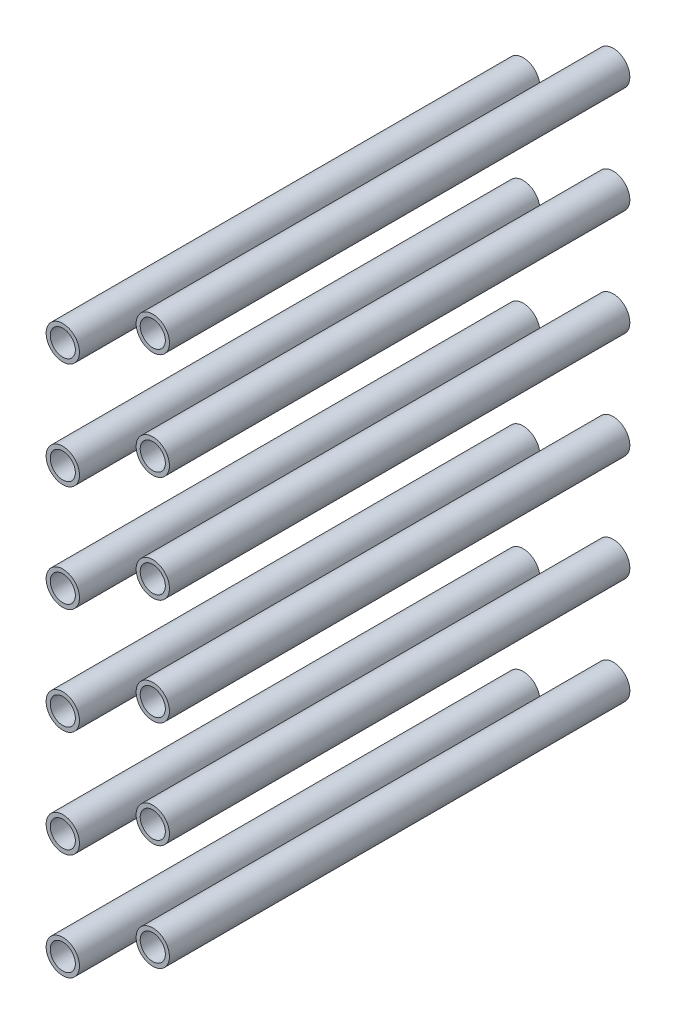
ISO-10303-21;
HEADER;
FILE_DESCRIPTION(('STEP AP214'),'2;1');
FILE_NAME('part.step','',(''),(''),'','','');
FILE_SCHEMA(('AUTOMOTIVE_DESIGN { 1 0 10303 214 1 1 1 1 }'));
ENDSEC;
DATA;
#1=APPLICATION_CONTEXT('core data for automotive mechanical design processes');
#2=APPLICATION_PROTOCOL_DEFINITION('international standard','automotive_design',2000,#1);
#3=PRODUCT_CONTEXT('',#1,'mechanical');
#4=PRODUCT('Part','Part','',(#3));
#5=PRODUCT_RELATED_PRODUCT_CATEGORY('part','',(#4));
#6=PRODUCT_DEFINITION_FORMATION('','',#4);
#7=PRODUCT_DEFINITION_CONTEXT('part definition',#1,'design');
#8=PRODUCT_DEFINITION('design','',#6,#7);
#9=PRODUCT_DEFINITION_SHAPE('','',#8);
#10=(LENGTH_UNIT() NAMED_UNIT(*) SI_UNIT(.MILLI.,.METRE.));
#11=(NAMED_UNIT(*) PLANE_ANGLE_UNIT() SI_UNIT($,.RADIAN.));
#12=(NAMED_UNIT(*) SI_UNIT($,.STERADIAN.) SOLID_ANGLE_UNIT());
#13=UNCERTAINTY_MEASURE_WITH_UNIT(LENGTH_MEASURE(1.E-05),#10,'distance_accuracy_value','');
#14=(GEOMETRIC_REPRESENTATION_CONTEXT(3) GLOBAL_UNCERTAINTY_ASSIGNED_CONTEXT((#13)) GLOBAL_UNIT_ASSIGNED_CONTEXT((#10,
#11,#12)) REPRESENTATION_CONTEXT('',''));
#15=CARTESIAN_POINT('',(0.,0.,0.));
#16=DIRECTION('',(0.,0.,1.));
#17=DIRECTION('',(1.,0.,0.));
#18=AXIS2_PLACEMENT_3D('',#15,#16,#17);
#19=CARTESIAN_POINT('',(21.4999999999996,139.7,-110.));
#20=DIRECTION('',(0.,0.,1.));
#21=DIRECTION('',(1.,0.,0.));
#22=AXIS2_PLACEMENT_3D('',#19,#20,#21);
#23=CYLINDRICAL_SURFACE('',#22,3.98);
#24=CARTESIAN_POINT('',(21.4999999999996,139.7,-110.));
#25=DIRECTION('',(0.,0.,1.));
#26=DIRECTION('',(1.,0.,0.));
#27=AXIS2_PLACEMENT_3D('',#24,#25,#26);
#28=CIRCLE('',#27,3.98);
#29=CARTESIAN_POINT('',(25.4799999999996,139.7,-110.));
#30=VERTEX_POINT('',#29);
#31=EDGE_CURVE('E11',#30,#30,#28,.T.);
#32=ORIENTED_EDGE('',*,*,#31,.T.);
#33=EDGE_LOOP('',(#32));
#34=FACE_BOUND('',#33,.T.);
#35=CARTESIAN_POINT('',(21.4999999999996,139.7,0.));
#36=DIRECTION('',(0.,0.,1.));
#37=DIRECTION('',(1.,0.,0.));
#38=AXIS2_PLACEMENT_3D('',#35,#36,#37);
#39=CIRCLE('',#38,3.98);
#40=CARTESIAN_POINT('',(25.4799999999996,139.7,0.));
#41=VERTEX_POINT('',#40);
#42=EDGE_CURVE('E43',#41,#41,#39,.T.);
#43=ORIENTED_EDGE('',*,*,#42,.F.);
#44=EDGE_LOOP('',(#43));
#45=FACE_BOUND('',#44,.T.);
#46=ADVANCED_FACE('F40',(#34,#45),#23,.T.);
#47=CARTESIAN_POINT('',(21.4999999999996,139.7,-110.));
#48=DIRECTION('',(0.,0.,1.));
#49=DIRECTION('',(1.,0.,0.));
#50=AXIS2_PLACEMENT_3D('',#47,#48,#49);
#51=PLANE('',#50);
#52=CARTESIAN_POINT('',(21.4999999999996,139.7,-110.));
#53=DIRECTION('',(0.,0.,1.));
#54=DIRECTION('',(1.,0.,0.));
#55=AXIS2_PLACEMENT_3D('',#52,#53,#54);
#56=CIRCLE('',#55,3.);
#57=CARTESIAN_POINT('',(24.4999999999996,139.7,-110.));
#58=VERTEX_POINT('',#57);
#59=EDGE_CURVE('E50',#58,#58,#56,.T.);
#60=ORIENTED_EDGE('',*,*,#59,.T.);
#61=EDGE_LOOP('',(#60));
#62=FACE_BOUND('',#61,.T.);
#63=ORIENTED_EDGE('',*,*,#31,.F.);
#64=EDGE_LOOP('',(#63));
#65=FACE_BOUND('',#64,.T.);
#66=ADVANCED_FACE('F58',(#62,#65),#51,.F.);
#67=CARTESIAN_POINT('',(21.4999999999996,139.7,0.));
#68=DIRECTION('',(0.,0.,1.));
#69=DIRECTION('',(1.,0.,0.));
#70=AXIS2_PLACEMENT_3D('',#67,#68,#69);
#71=PLANE('',#70);
#72=CARTESIAN_POINT('',(21.4999999999996,139.7,0.));
#73=DIRECTION('',(0.,0.,1.));
#74=DIRECTION('',(1.,0.,0.));
#75=AXIS2_PLACEMENT_3D('',#72,#73,#74);
#76=CIRCLE('',#75,3.);
#77=CARTESIAN_POINT('',(24.4999999999996,139.7,0.));
#78=VERTEX_POINT('',#77);
#79=EDGE_CURVE('E52',#78,#78,#76,.T.);
#80=ORIENTED_EDGE('',*,*,#79,.F.);
#81=EDGE_LOOP('',(#80));
#82=FACE_BOUND('',#81,.T.);
#83=ORIENTED_EDGE('',*,*,#42,.T.);
#84=EDGE_LOOP('',(#83));
#85=FACE_BOUND('',#84,.T.);
#86=ADVANCED_FACE('F64',(#82,#85),#71,.T.);
#87=CARTESIAN_POINT('',(21.4999999999996,139.7,-110.));
#88=DIRECTION('',(0.,0.,1.));
#89=DIRECTION('',(1.,0.,0.));
#90=AXIS2_PLACEMENT_3D('',#87,#88,#89);
#91=CYLINDRICAL_SURFACE('',#90,3.);
#92=ORIENTED_EDGE('',*,*,#59,.F.);
#93=EDGE_LOOP('',(#92));
#94=FACE_BOUND('',#93,.T.);
#95=ORIENTED_EDGE('',*,*,#79,.T.);
#96=EDGE_LOOP('',(#95));
#97=FACE_BOUND('',#96,.T.);
#98=ADVANCED_FACE('F61',(#94,#97),#91,.F.);
#99=CLOSED_SHELL('',(#46,#66,#86,#98));
#100=MANIFOLD_SOLID_BREP('B2',#99);
#101=CARTESIAN_POINT('',(21.4999999999996,114.3,-110.));
#102=DIRECTION('',(0.,0.,1.));
#103=DIRECTION('',(1.,0.,0.));
#104=AXIS2_PLACEMENT_3D('',#101,#102,#103);
#105=CYLINDRICAL_SURFACE('',#104,3.98);
#106=CARTESIAN_POINT('',(21.4999999999996,114.3,-110.));
#107=DIRECTION('',(0.,0.,1.));
#108=DIRECTION('',(1.,0.,0.));
#109=AXIS2_PLACEMENT_3D('',#106,#107,#108);
#110=CIRCLE('',#109,3.98);
#111=CARTESIAN_POINT('',(25.4799999999996,114.3,-110.));
#112=VERTEX_POINT('',#111);
#113=EDGE_CURVE('E39',#112,#112,#110,.T.);
#114=ORIENTED_EDGE('',*,*,#113,.T.);
#115=EDGE_LOOP('',(#114));
#116=FACE_BOUND('',#115,.T.);
#117=CARTESIAN_POINT('',(21.4999999999996,114.3,0.));
#118=DIRECTION('',(0.,0.,1.));
#119=DIRECTION('',(1.,0.,0.));
#120=AXIS2_PLACEMENT_3D('',#117,#118,#119);
#121=CIRCLE('',#120,3.98);
#122=CARTESIAN_POINT('',(25.4799999999996,114.3,0.));
#123=VERTEX_POINT('',#122);
#124=EDGE_CURVE('E113',#123,#123,#121,.T.);
#125=ORIENTED_EDGE('',*,*,#124,.F.);
#126=EDGE_LOOP('',(#125));
#127=FACE_BOUND('',#126,.T.);
#128=ADVANCED_FACE('F110',(#116,#127),#105,.T.);
#129=CARTESIAN_POINT('',(21.4999999999996,114.3,-110.));
#130=DIRECTION('',(0.,0.,1.));
#131=DIRECTION('',(1.,0.,0.));
#132=AXIS2_PLACEMENT_3D('',#129,#130,#131);
#133=PLANE('',#132);
#134=CARTESIAN_POINT('',(21.4999999999996,114.3,-110.));
#135=DIRECTION('',(0.,0.,1.));
#136=DIRECTION('',(1.,0.,0.));
#137=AXIS2_PLACEMENT_3D('',#134,#135,#136);
#138=CIRCLE('',#137,3.);
#139=CARTESIAN_POINT('',(24.4999999999996,114.3,-110.));
#140=VERTEX_POINT('',#139);
#141=EDGE_CURVE('E120',#140,#140,#138,.T.);
#142=ORIENTED_EDGE('',*,*,#141,.T.);
#143=EDGE_LOOP('',(#142));
#144=FACE_BOUND('',#143,.T.);
#145=ORIENTED_EDGE('',*,*,#113,.F.);
#146=EDGE_LOOP('',(#145));
#147=FACE_BOUND('',#146,.T.);
#148=ADVANCED_FACE('F128',(#144,#147),#133,.F.);
#149=CARTESIAN_POINT('',(21.4999999999996,114.3,0.));
#150=DIRECTION('',(0.,0.,1.));
#151=DIRECTION('',(1.,0.,0.));
#152=AXIS2_PLACEMENT_3D('',#149,#150,#151);
#153=PLANE('',#152);
#154=CARTESIAN_POINT('',(21.4999999999996,114.3,0.));
#155=DIRECTION('',(0.,0.,1.));
#156=DIRECTION('',(1.,0.,0.));
#157=AXIS2_PLACEMENT_3D('',#154,#155,#156);
#158=CIRCLE('',#157,3.);
#159=CARTESIAN_POINT('',(24.4999999999996,114.3,0.));
#160=VERTEX_POINT('',#159);
#161=EDGE_CURVE('E122',#160,#160,#158,.T.);
#162=ORIENTED_EDGE('',*,*,#161,.F.);
#163=EDGE_LOOP('',(#162));
#164=FACE_BOUND('',#163,.T.);
#165=ORIENTED_EDGE('',*,*,#124,.T.);
#166=EDGE_LOOP('',(#165));
#167=FACE_BOUND('',#166,.T.);
#168=ADVANCED_FACE('F134',(#164,#167),#153,.T.);
#169=CARTESIAN_POINT('',(21.4999999999996,114.3,-110.));
#170=DIRECTION('',(0.,0.,1.));
#171=DIRECTION('',(1.,0.,0.));
#172=AXIS2_PLACEMENT_3D('',#169,#170,#171);
#173=CYLINDRICAL_SURFACE('',#172,3.);
#174=ORIENTED_EDGE('',*,*,#141,.F.);
#175=EDGE_LOOP('',(#174));
#176=FACE_BOUND('',#175,.T.);
#177=ORIENTED_EDGE('',*,*,#161,.T.);
#178=EDGE_LOOP('',(#177));
#179=FACE_BOUND('',#178,.T.);
#180=ADVANCED_FACE('F131',(#176,#179),#173,.F.);
#181=CLOSED_SHELL('',(#128,#148,#168,#180));
#182=MANIFOLD_SOLID_BREP('B6',#181);
#183=CARTESIAN_POINT('',(21.4999999999997,88.9,-110.));
#184=DIRECTION('',(0.,0.,1.));
#185=DIRECTION('',(1.,0.,0.));
#186=AXIS2_PLACEMENT_3D('',#183,#184,#185);
#187=CYLINDRICAL_SURFACE('',#186,3.98);
#188=CARTESIAN_POINT('',(21.4999999999997,88.9,-110.));
#189=DIRECTION('',(0.,0.,1.));
#190=DIRECTION('',(1.,0.,0.));
#191=AXIS2_PLACEMENT_3D('',#188,#189,#190);
#192=CIRCLE('',#191,3.98);
#193=CARTESIAN_POINT('',(25.4799999999997,88.9,-110.));
#194=VERTEX_POINT('',#193);
#195=EDGE_CURVE('E109',#194,#194,#192,.T.);
#196=ORIENTED_EDGE('',*,*,#195,.T.);
#197=EDGE_LOOP('',(#196));
#198=FACE_BOUND('',#197,.T.);
#199=CARTESIAN_POINT('',(21.4999999999997,88.9,0.));
#200=DIRECTION('',(0.,0.,1.));
#201=DIRECTION('',(1.,0.,0.));
#202=AXIS2_PLACEMENT_3D('',#199,#200,#201);
#203=CIRCLE('',#202,3.98);
#204=CARTESIAN_POINT('',(25.4799999999997,88.9,0.));
#205=VERTEX_POINT('',#204);
#206=EDGE_CURVE('E183',#205,#205,#203,.T.);
#207=ORIENTED_EDGE('',*,*,#206,.F.);
#208=EDGE_LOOP('',(#207));
#209=FACE_BOUND('',#208,.T.);
#210=ADVANCED_FACE('F180',(#198,#209),#187,.T.);
#211=CARTESIAN_POINT('',(21.4999999999997,88.9,-110.));
#212=DIRECTION('',(0.,0.,1.));
#213=DIRECTION('',(1.,0.,0.));
#214=AXIS2_PLACEMENT_3D('',#211,#212,#213);
#215=PLANE('',#214);
#216=CARTESIAN_POINT('',(21.4999999999997,88.9,-110.));
#217=DIRECTION('',(0.,0.,1.));
#218=DIRECTION('',(1.,0.,0.));
#219=AXIS2_PLACEMENT_3D('',#216,#217,#218);
#220=CIRCLE('',#219,3.);
#221=CARTESIAN_POINT('',(24.4999999999997,88.9,-110.));
#222=VERTEX_POINT('',#221);
#223=EDGE_CURVE('E190',#222,#222,#220,.T.);
#224=ORIENTED_EDGE('',*,*,#223,.T.);
#225=EDGE_LOOP('',(#224));
#226=FACE_BOUND('',#225,.T.);
#227=ORIENTED_EDGE('',*,*,#195,.F.);
#228=EDGE_LOOP('',(#227));
#229=FACE_BOUND('',#228,.T.);
#230=ADVANCED_FACE('F198',(#226,#229),#215,.F.);
#231=CARTESIAN_POINT('',(21.4999999999997,88.9,0.));
#232=DIRECTION('',(0.,0.,1.));
#233=DIRECTION('',(1.,0.,0.));
#234=AXIS2_PLACEMENT_3D('',#231,#232,#233);
#235=PLANE('',#234);
#236=CARTESIAN_POINT('',(21.4999999999997,88.9,0.));
#237=DIRECTION('',(0.,0.,1.));
#238=DIRECTION('',(1.,0.,0.));
#239=AXIS2_PLACEMENT_3D('',#236,#237,#238);
#240=CIRCLE('',#239,3.);
#241=CARTESIAN_POINT('',(24.4999999999997,88.9,0.));
#242=VERTEX_POINT('',#241);
#243=EDGE_CURVE('E192',#242,#242,#240,.T.);
#244=ORIENTED_EDGE('',*,*,#243,.F.);
#245=EDGE_LOOP('',(#244));
#246=FACE_BOUND('',#245,.T.);
#247=ORIENTED_EDGE('',*,*,#206,.T.);
#248=EDGE_LOOP('',(#247));
#249=FACE_BOUND('',#248,.T.);
#250=ADVANCED_FACE('F204',(#246,#249),#235,.T.);
#251=CARTESIAN_POINT('',(21.4999999999997,88.9,-110.));
#252=DIRECTION('',(0.,0.,1.));
#253=DIRECTION('',(1.,0.,0.));
#254=AXIS2_PLACEMENT_3D('',#251,#252,#253);
#255=CYLINDRICAL_SURFACE('',#254,3.);
#256=ORIENTED_EDGE('',*,*,#223,.F.);
#257=EDGE_LOOP('',(#256));
#258=FACE_BOUND('',#257,.T.);
#259=ORIENTED_EDGE('',*,*,#243,.T.);
#260=EDGE_LOOP('',(#259));
#261=FACE_BOUND('',#260,.T.);
#262=ADVANCED_FACE('F201',(#258,#261),#255,.F.);
#263=CLOSED_SHELL('',(#210,#230,#250,#262));
#264=MANIFOLD_SOLID_BREP('B34',#263);
#265=CARTESIAN_POINT('',(21.4999999999998,63.5,-110.));
#266=DIRECTION('',(0.,0.,1.));
#267=DIRECTION('',(1.,0.,0.));
#268=AXIS2_PLACEMENT_3D('',#265,#266,#267);
#269=CYLINDRICAL_SURFACE('',#268,3.98);
#270=CARTESIAN_POINT('',(21.4999999999998,63.5,-110.));
#271=DIRECTION('',(0.,0.,1.));
#272=DIRECTION('',(1.,0.,0.));
#273=AXIS2_PLACEMENT_3D('',#270,#271,#272);
#274=CIRCLE('',#273,3.98);
#275=CARTESIAN_POINT('',(25.4799999999998,63.5,-110.));
#276=VERTEX_POINT('',#275);
#277=EDGE_CURVE('E179',#276,#276,#274,.T.);
#278=ORIENTED_EDGE('',*,*,#277,.T.);
#279=EDGE_LOOP('',(#278));
#280=FACE_BOUND('',#279,.T.);
#281=CARTESIAN_POINT('',(21.4999999999998,63.5,0.));
#282=DIRECTION('',(0.,0.,1.));
#283=DIRECTION('',(1.,0.,0.));
#284=AXIS2_PLACEMENT_3D('',#281,#282,#283);
#285=CIRCLE('',#284,3.98);
#286=CARTESIAN_POINT('',(25.4799999999998,63.5,0.));
#287=VERTEX_POINT('',#286);
#288=EDGE_CURVE('E253',#287,#287,#285,.T.);
#289=ORIENTED_EDGE('',*,*,#288,.F.);
#290=EDGE_LOOP('',(#289));
#291=FACE_BOUND('',#290,.T.);
#292=ADVANCED_FACE('F250',(#280,#291),#269,.T.);
#293=CARTESIAN_POINT('',(21.4999999999998,63.5,-110.));
#294=DIRECTION('',(0.,0.,1.));
#295=DIRECTION('',(1.,0.,0.));
#296=AXIS2_PLACEMENT_3D('',#293,#294,#295);
#297=PLANE('',#296);
#298=CARTESIAN_POINT('',(21.4999999999998,63.5,-110.));
#299=DIRECTION('',(0.,0.,1.));
#300=DIRECTION('',(1.,0.,0.));
#301=AXIS2_PLACEMENT_3D('',#298,#299,#300);
#302=CIRCLE('',#301,3.);
#303=CARTESIAN_POINT('',(24.4999999999998,63.5,-110.));
#304=VERTEX_POINT('',#303);
#305=EDGE_CURVE('E260',#304,#304,#302,.T.);
#306=ORIENTED_EDGE('',*,*,#305,.T.);
#307=EDGE_LOOP('',(#306));
#308=FACE_BOUND('',#307,.T.);
#309=ORIENTED_EDGE('',*,*,#277,.F.);
#310=EDGE_LOOP('',(#309));
#311=FACE_BOUND('',#310,.T.);
#312=ADVANCED_FACE('F268',(#308,#311),#297,.F.);
#313=CARTESIAN_POINT('',(21.4999999999998,63.5,0.));
#314=DIRECTION('',(0.,0.,1.));
#315=DIRECTION('',(1.,0.,0.));
#316=AXIS2_PLACEMENT_3D('',#313,#314,#315);
#317=PLANE('',#316);
#318=CARTESIAN_POINT('',(21.4999999999998,63.5,0.));
#319=DIRECTION('',(0.,0.,1.));
#320=DIRECTION('',(1.,0.,0.));
#321=AXIS2_PLACEMENT_3D('',#318,#319,#320);
#322=CIRCLE('',#321,3.);
#323=CARTESIAN_POINT('',(24.4999999999998,63.5,0.));
#324=VERTEX_POINT('',#323);
#325=EDGE_CURVE('E262',#324,#324,#322,.T.);
#326=ORIENTED_EDGE('',*,*,#325,.F.);
#327=EDGE_LOOP('',(#326));
#328=FACE_BOUND('',#327,.T.);
#329=ORIENTED_EDGE('',*,*,#288,.T.);
#330=EDGE_LOOP('',(#329));
#331=FACE_BOUND('',#330,.T.);
#332=ADVANCED_FACE('F274',(#328,#331),#317,.T.);
#333=CARTESIAN_POINT('',(21.4999999999998,63.5,-110.));
#334=DIRECTION('',(0.,0.,1.));
#335=DIRECTION('',(1.,0.,0.));
#336=AXIS2_PLACEMENT_3D('',#333,#334,#335);
#337=CYLINDRICAL_SURFACE('',#336,3.);
#338=ORIENTED_EDGE('',*,*,#305,.F.);
#339=EDGE_LOOP('',(#338));
#340=FACE_BOUND('',#339,.T.);
#341=ORIENTED_EDGE('',*,*,#325,.T.);
#342=EDGE_LOOP('',(#341));
#343=FACE_BOUND('',#342,.T.);
#344=ADVANCED_FACE('F271',(#340,#343),#337,.F.);
#345=CLOSED_SHELL('',(#292,#312,#332,#344));
#346=MANIFOLD_SOLID_BREP('B104',#345);
#347=CARTESIAN_POINT('',(21.4999999999999,38.1,-110.));
#348=DIRECTION('',(0.,0.,1.));
#349=DIRECTION('',(1.,0.,0.));
#350=AXIS2_PLACEMENT_3D('',#347,#348,#349);
#351=CYLINDRICAL_SURFACE('',#350,3.98);
#352=CARTESIAN_POINT('',(21.4999999999999,38.1,-110.));
#353=DIRECTION('',(0.,0.,1.));
#354=DIRECTION('',(1.,0.,0.));
#355=AXIS2_PLACEMENT_3D('',#352,#353,#354);
#356=CIRCLE('',#355,3.98);
#357=CARTESIAN_POINT('',(25.4799999999999,38.1,-110.));
#358=VERTEX_POINT('',#357);
#359=EDGE_CURVE('E249',#358,#358,#356,.T.);
#360=ORIENTED_EDGE('',*,*,#359,.T.);
#361=EDGE_LOOP('',(#360));
#362=FACE_BOUND('',#361,.T.);
#363=CARTESIAN_POINT('',(21.4999999999999,38.1,0.));
#364=DIRECTION('',(0.,0.,1.));
#365=DIRECTION('',(1.,0.,0.));
#366=AXIS2_PLACEMENT_3D('',#363,#364,#365);
#367=CIRCLE('',#366,3.98);
#368=CARTESIAN_POINT('',(25.4799999999999,38.1,0.));
#369=VERTEX_POINT('',#368);
#370=EDGE_CURVE('E323',#369,#369,#367,.T.);
#371=ORIENTED_EDGE('',*,*,#370,.F.);
#372=EDGE_LOOP('',(#371));
#373=FACE_BOUND('',#372,.T.);
#374=ADVANCED_FACE('F320',(#362,#373),#351,.T.);
#375=CARTESIAN_POINT('',(21.4999999999999,38.1,-110.));
#376=DIRECTION('',(0.,0.,1.));
#377=DIRECTION('',(1.,0.,0.));
#378=AXIS2_PLACEMENT_3D('',#375,#376,#377);
#379=PLANE('',#378);
#380=CARTESIAN_POINT('',(21.4999999999999,38.1,-110.));
#381=DIRECTION('',(0.,0.,1.));
#382=DIRECTION('',(1.,0.,0.));
#383=AXIS2_PLACEMENT_3D('',#380,#381,#382);
#384=CIRCLE('',#383,3.);
#385=CARTESIAN_POINT('',(24.4999999999999,38.1,-110.));
#386=VERTEX_POINT('',#385);
#387=EDGE_CURVE('E330',#386,#386,#384,.T.);
#388=ORIENTED_EDGE('',*,*,#387,.T.);
#389=EDGE_LOOP('',(#388));
#390=FACE_BOUND('',#389,.T.);
#391=ORIENTED_EDGE('',*,*,#359,.F.);
#392=EDGE_LOOP('',(#391));
#393=FACE_BOUND('',#392,.T.);
#394=ADVANCED_FACE('F338',(#390,#393),#379,.F.);
#395=CARTESIAN_POINT('',(21.4999999999999,38.1,0.));
#396=DIRECTION('',(0.,0.,1.));
#397=DIRECTION('',(1.,0.,0.));
#398=AXIS2_PLACEMENT_3D('',#395,#396,#397);
#399=PLANE('',#398);
#400=CARTESIAN_POINT('',(21.4999999999999,38.1,0.));
#401=DIRECTION('',(0.,0.,1.));
#402=DIRECTION('',(1.,0.,0.));
#403=AXIS2_PLACEMENT_3D('',#400,#401,#402);
#404=CIRCLE('',#403,3.);
#405=CARTESIAN_POINT('',(24.4999999999999,38.1,0.));
#406=VERTEX_POINT('',#405);
#407=EDGE_CURVE('E332',#406,#406,#404,.T.);
#408=ORIENTED_EDGE('',*,*,#407,.F.);
#409=EDGE_LOOP('',(#408));
#410=FACE_BOUND('',#409,.T.);
#411=ORIENTED_EDGE('',*,*,#370,.T.);
#412=EDGE_LOOP('',(#411));
#413=FACE_BOUND('',#412,.T.);
#414=ADVANCED_FACE('F344',(#410,#413),#399,.T.);
#415=CARTESIAN_POINT('',(21.4999999999999,38.1,-110.));
#416=DIRECTION('',(0.,0.,1.));
#417=DIRECTION('',(1.,0.,0.));
#418=AXIS2_PLACEMENT_3D('',#415,#416,#417);
#419=CYLINDRICAL_SURFACE('',#418,3.);
#420=ORIENTED_EDGE('',*,*,#387,.F.);
#421=EDGE_LOOP('',(#420));
#422=FACE_BOUND('',#421,.T.);
#423=ORIENTED_EDGE('',*,*,#407,.T.);
#424=EDGE_LOOP('',(#423));
#425=FACE_BOUND('',#424,.T.);
#426=ADVANCED_FACE('F341',(#422,#425),#419,.F.);
#427=CLOSED_SHELL('',(#374,#394,#414,#426));
#428=MANIFOLD_SOLID_BREP('B174',#427);
#429=CARTESIAN_POINT('',(-4.43418130033078E-13,127.,-110.));
#430=DIRECTION('',(0.,0.,1.));
#431=DIRECTION('',(1.,0.,0.));
#432=AXIS2_PLACEMENT_3D('',#429,#430,#431);
#433=CYLINDRICAL_SURFACE('',#432,3.98);
#434=CARTESIAN_POINT('',(-4.43418130033078E-13,127.,-110.));
#435=DIRECTION('',(0.,0.,1.));
#436=DIRECTION('',(1.,0.,0.));
#437=AXIS2_PLACEMENT_3D('',#434,#435,#436);
#438=CIRCLE('',#437,3.98);
#439=CARTESIAN_POINT('',(3.97999999999956,127.,-110.));
#440=VERTEX_POINT('',#439);
#441=EDGE_CURVE('E319',#440,#440,#438,.T.);
#442=ORIENTED_EDGE('',*,*,#441,.T.);
#443=EDGE_LOOP('',(#442));
#444=FACE_BOUND('',#443,.T.);
#445=CARTESIAN_POINT('',(-4.43418130033078E-13,127.,0.));
#446=DIRECTION('',(0.,0.,1.));
#447=DIRECTION('',(1.,0.,0.));
#448=AXIS2_PLACEMENT_3D('',#445,#446,#447);
#449=CIRCLE('',#448,3.98);
#450=CARTESIAN_POINT('',(3.97999999999956,127.,0.));
#451=VERTEX_POINT('',#450);
#452=EDGE_CURVE('E393',#451,#451,#449,.T.);
#453=ORIENTED_EDGE('',*,*,#452,.F.);
#454=EDGE_LOOP('',(#453));
#455=FACE_BOUND('',#454,.T.);
#456=ADVANCED_FACE('F390',(#444,#455),#433,.T.);
#457=CARTESIAN_POINT('',(-4.43418130033078E-13,127.,-110.));
#458=DIRECTION('',(0.,0.,1.));
#459=DIRECTION('',(1.,0.,0.));
#460=AXIS2_PLACEMENT_3D('',#457,#458,#459);
#461=PLANE('',#460);
#462=CARTESIAN_POINT('',(-4.43418130033078E-13,127.,-110.));
#463=DIRECTION('',(0.,0.,1.));
#464=DIRECTION('',(1.,0.,0.));
#465=AXIS2_PLACEMENT_3D('',#462,#463,#464);
#466=CIRCLE('',#465,3.);
#467=CARTESIAN_POINT('',(2.99999999999956,127.,-110.));
#468=VERTEX_POINT('',#467);
#469=EDGE_CURVE('E400',#468,#468,#466,.T.);
#470=ORIENTED_EDGE('',*,*,#469,.T.);
#471=EDGE_LOOP('',(#470));
#472=FACE_BOUND('',#471,.T.);
#473=ORIENTED_EDGE('',*,*,#441,.F.);
#474=EDGE_LOOP('',(#473));
#475=FACE_BOUND('',#474,.T.);
#476=ADVANCED_FACE('F408',(#472,#475),#461,.F.);
#477=CARTESIAN_POINT('',(-4.43418130033078E-13,127.,0.));
#478=DIRECTION('',(0.,0.,1.));
#479=DIRECTION('',(1.,0.,0.));
#480=AXIS2_PLACEMENT_3D('',#477,#478,#479);
#481=PLANE('',#480);
#482=CARTESIAN_POINT('',(-4.43418130033078E-13,127.,0.));
#483=DIRECTION('',(0.,0.,1.));
#484=DIRECTION('',(1.,0.,0.));
#485=AXIS2_PLACEMENT_3D('',#482,#483,#484);
#486=CIRCLE('',#485,3.);
#487=CARTESIAN_POINT('',(2.99999999999956,127.,0.));
#488=VERTEX_POINT('',#487);
#489=EDGE_CURVE('E402',#488,#488,#486,.T.);
#490=ORIENTED_EDGE('',*,*,#489,.F.);
#491=EDGE_LOOP('',(#490));
#492=FACE_BOUND('',#491,.T.);
#493=ORIENTED_EDGE('',*,*,#452,.T.);
#494=EDGE_LOOP('',(#493));
#495=FACE_BOUND('',#494,.T.);
#496=ADVANCED_FACE('F414',(#492,#495),#481,.T.);
#497=CARTESIAN_POINT('',(-4.43418130033078E-13,127.,-110.));
#498=DIRECTION('',(0.,0.,1.));
#499=DIRECTION('',(1.,0.,0.));
#500=AXIS2_PLACEMENT_3D('',#497,#498,#499);
#501=CYLINDRICAL_SURFACE('',#500,3.);
#502=ORIENTED_EDGE('',*,*,#469,.F.);
#503=EDGE_LOOP('',(#502));
#504=FACE_BOUND('',#503,.T.);
#505=ORIENTED_EDGE('',*,*,#489,.T.);
#506=EDGE_LOOP('',(#505));
#507=FACE_BOUND('',#506,.T.);
#508=ADVANCED_FACE('F411',(#504,#507),#501,.F.);
#509=CLOSED_SHELL('',(#456,#476,#496,#508));
#510=MANIFOLD_SOLID_BREP('B244',#509);
#511=CARTESIAN_POINT('',(-3.54734504026462E-13,101.6,-110.));
#512=DIRECTION('',(0.,0.,1.));
#513=DIRECTION('',(1.,0.,0.));
#514=AXIS2_PLACEMENT_3D('',#511,#512,#513);
#515=CYLINDRICAL_SURFACE('',#514,3.98);
#516=CARTESIAN_POINT('',(-3.54734504026462E-13,101.6,-110.));
#517=DIRECTION('',(0.,0.,1.));
#518=DIRECTION('',(1.,0.,0.));
#519=AXIS2_PLACEMENT_3D('',#516,#517,#518);
#520=CIRCLE('',#519,3.98);
#521=CARTESIAN_POINT('',(3.97999999999965,101.6,-110.));
#522=VERTEX_POINT('',#521);
#523=EDGE_CURVE('E389',#522,#522,#520,.T.);
#524=ORIENTED_EDGE('',*,*,#523,.T.);
#525=EDGE_LOOP('',(#524));
#526=FACE_BOUND('',#525,.T.);
#527=CARTESIAN_POINT('',(-3.54734504026462E-13,101.6,0.));
#528=DIRECTION('',(0.,0.,1.));
#529=DIRECTION('',(1.,0.,0.));
#530=AXIS2_PLACEMENT_3D('',#527,#528,#529);
#531=CIRCLE('',#530,3.98);
#532=CARTESIAN_POINT('',(3.97999999999965,101.6,0.));
#533=VERTEX_POINT('',#532);
#534=EDGE_CURVE('E463',#533,#533,#531,.T.);
#535=ORIENTED_EDGE('',*,*,#534,.F.);
#536=EDGE_LOOP('',(#535));
#537=FACE_BOUND('',#536,.T.);
#538=ADVANCED_FACE('F460',(#526,#537),#515,.T.);
#539=CARTESIAN_POINT('',(-3.54734504026462E-13,101.6,-110.));
#540=DIRECTION('',(0.,0.,1.));
#541=DIRECTION('',(1.,0.,0.));
#542=AXIS2_PLACEMENT_3D('',#539,#540,#541);
#543=PLANE('',#542);
#544=CARTESIAN_POINT('',(-3.54734504026462E-13,101.6,-110.));
#545=DIRECTION('',(0.,0.,1.));
#546=DIRECTION('',(1.,0.,0.));
#547=AXIS2_PLACEMENT_3D('',#544,#545,#546);
#548=CIRCLE('',#547,3.);
#549=CARTESIAN_POINT('',(2.99999999999965,101.6,-110.));
#550=VERTEX_POINT('',#549);
#551=EDGE_CURVE('E470',#550,#550,#548,.T.);
#552=ORIENTED_EDGE('',*,*,#551,.T.);
#553=EDGE_LOOP('',(#552));
#554=FACE_BOUND('',#553,.T.);
#555=ORIENTED_EDGE('',*,*,#523,.F.);
#556=EDGE_LOOP('',(#555));
#557=FACE_BOUND('',#556,.T.);
#558=ADVANCED_FACE('F478',(#554,#557),#543,.F.);
#559=CARTESIAN_POINT('',(-3.54734504026462E-13,101.6,0.));
#560=DIRECTION('',(0.,0.,1.));
#561=DIRECTION('',(1.,0.,0.));
#562=AXIS2_PLACEMENT_3D('',#559,#560,#561);
#563=PLANE('',#562);
#564=CARTESIAN_POINT('',(-3.54734504026462E-13,101.6,0.));
#565=DIRECTION('',(0.,0.,1.));
#566=DIRECTION('',(1.,0.,0.));
#567=AXIS2_PLACEMENT_3D('',#564,#565,#566);
#568=CIRCLE('',#567,3.);
#569=CARTESIAN_POINT('',(2.99999999999965,101.6,0.));
#570=VERTEX_POINT('',#569);
#571=EDGE_CURVE('E472',#570,#570,#568,.T.);
#572=ORIENTED_EDGE('',*,*,#571,.F.);
#573=EDGE_LOOP('',(#572));
#574=FACE_BOUND('',#573,.T.);
#575=ORIENTED_EDGE('',*,*,#534,.T.);
#576=EDGE_LOOP('',(#575));
#577=FACE_BOUND('',#576,.T.);
#578=ADVANCED_FACE('F484',(#574,#577),#563,.T.);
#579=CARTESIAN_POINT('',(-3.54734504026462E-13,101.6,-110.));
#580=DIRECTION('',(0.,0.,1.));
#581=DIRECTION('',(1.,0.,0.));
#582=AXIS2_PLACEMENT_3D('',#579,#580,#581);
#583=CYLINDRICAL_SURFACE('',#582,3.);
#584=ORIENTED_EDGE('',*,*,#551,.F.);
#585=EDGE_LOOP('',(#584));
#586=FACE_BOUND('',#585,.T.);
#587=ORIENTED_EDGE('',*,*,#571,.T.);
#588=EDGE_LOOP('',(#587));
#589=FACE_BOUND('',#588,.T.);
#590=ADVANCED_FACE('F481',(#586,#589),#583,.F.);
#591=CLOSED_SHELL('',(#538,#558,#578,#590));
#592=MANIFOLD_SOLID_BREP('B314',#591);
#593=CARTESIAN_POINT('',(-2.66050878019847E-13,76.2,-110.));
#594=DIRECTION('',(0.,0.,1.));
#595=DIRECTION('',(1.,0.,0.));
#596=AXIS2_PLACEMENT_3D('',#593,#594,#595);
#597=CYLINDRICAL_SURFACE('',#596,3.98);
#598=CARTESIAN_POINT('',(-2.66050878019847E-13,76.2,-110.));
#599=DIRECTION('',(0.,0.,1.));
#600=DIRECTION('',(1.,0.,0.));
#601=AXIS2_PLACEMENT_3D('',#598,#599,#600);
#602=CIRCLE('',#601,3.98);
#603=CARTESIAN_POINT('',(3.97999999999973,76.2,-110.));
#604=VERTEX_POINT('',#603);
#605=EDGE_CURVE('E459',#604,#604,#602,.T.);
#606=ORIENTED_EDGE('',*,*,#605,.T.);
#607=EDGE_LOOP('',(#606));
#608=FACE_BOUND('',#607,.T.);
#609=CARTESIAN_POINT('',(-2.66050878019847E-13,76.2,0.));
#610=DIRECTION('',(0.,0.,1.));
#611=DIRECTION('',(1.,0.,0.));
#612=AXIS2_PLACEMENT_3D('',#609,#610,#611);
#613=CIRCLE('',#612,3.98);
#614=CARTESIAN_POINT('',(3.97999999999973,76.2,0.));
#615=VERTEX_POINT('',#614);
#616=EDGE_CURVE('E533',#615,#615,#613,.T.);
#617=ORIENTED_EDGE('',*,*,#616,.F.);
#618=EDGE_LOOP('',(#617));
#619=FACE_BOUND('',#618,.T.);
#620=ADVANCED_FACE('F530',(#608,#619),#597,.T.);
#621=CARTESIAN_POINT('',(-2.66050878019847E-13,76.2,-110.));
#622=DIRECTION('',(0.,0.,1.));
#623=DIRECTION('',(1.,0.,0.));
#624=AXIS2_PLACEMENT_3D('',#621,#622,#623);
#625=PLANE('',#624);
#626=CARTESIAN_POINT('',(-2.66050878019847E-13,76.2,-110.));
#627=DIRECTION('',(0.,0.,1.));
#628=DIRECTION('',(1.,0.,0.));
#629=AXIS2_PLACEMENT_3D('',#626,#627,#628);
#630=CIRCLE('',#629,3.);
#631=CARTESIAN_POINT('',(2.99999999999973,76.2,-110.));
#632=VERTEX_POINT('',#631);
#633=EDGE_CURVE('E540',#632,#632,#630,.T.);
#634=ORIENTED_EDGE('',*,*,#633,.T.);
#635=EDGE_LOOP('',(#634));
#636=FACE_BOUND('',#635,.T.);
#637=ORIENTED_EDGE('',*,*,#605,.F.);
#638=EDGE_LOOP('',(#637));
#639=FACE_BOUND('',#638,.T.);
#640=ADVANCED_FACE('F548',(#636,#639),#625,.F.);
#641=CARTESIAN_POINT('',(-2.66050878019847E-13,76.2,0.));
#642=DIRECTION('',(0.,0.,1.));
#643=DIRECTION('',(1.,0.,0.));
#644=AXIS2_PLACEMENT_3D('',#641,#642,#643);
#645=PLANE('',#644);
#646=CARTESIAN_POINT('',(-2.66050878019847E-13,76.2,0.));
#647=DIRECTION('',(0.,0.,1.));
#648=DIRECTION('',(1.,0.,0.));
#649=AXIS2_PLACEMENT_3D('',#646,#647,#648);
#650=CIRCLE('',#649,3.);
#651=CARTESIAN_POINT('',(2.99999999999973,76.2,0.));
#652=VERTEX_POINT('',#651);
#653=EDGE_CURVE('E542',#652,#652,#650,.T.);
#654=ORIENTED_EDGE('',*,*,#653,.F.);
#655=EDGE_LOOP('',(#654));
#656=FACE_BOUND('',#655,.T.);
#657=ORIENTED_EDGE('',*,*,#616,.T.);
#658=EDGE_LOOP('',(#657));
#659=FACE_BOUND('',#658,.T.);
#660=ADVANCED_FACE('F554',(#656,#659),#645,.T.);
#661=CARTESIAN_POINT('',(-2.66050878019847E-13,76.2,-110.));
#662=DIRECTION('',(0.,0.,1.));
#663=DIRECTION('',(1.,0.,0.));
#664=AXIS2_PLACEMENT_3D('',#661,#662,#663);
#665=CYLINDRICAL_SURFACE('',#664,3.);
#666=ORIENTED_EDGE('',*,*,#633,.F.);
#667=EDGE_LOOP('',(#666));
#668=FACE_BOUND('',#667,.T.);
#669=ORIENTED_EDGE('',*,*,#653,.T.);
#670=EDGE_LOOP('',(#669));
#671=FACE_BOUND('',#670,.T.);
#672=ADVANCED_FACE('F551',(#668,#671),#665,.F.);
#673=CLOSED_SHELL('',(#620,#640,#660,#672));
#674=MANIFOLD_SOLID_BREP('B384',#673);
#675=CARTESIAN_POINT('',(-1.77367252013231E-13,50.8,-110.));
#676=DIRECTION('',(0.,0.,1.));
#677=DIRECTION('',(1.,0.,0.));
#678=AXIS2_PLACEMENT_3D('',#675,#676,#677);
#679=CYLINDRICAL_SURFACE('',#678,3.98);
#680=CARTESIAN_POINT('',(-1.77367252013231E-13,50.8,-110.));
#681=DIRECTION('',(0.,0.,1.));
#682=DIRECTION('',(1.,0.,0.));
#683=AXIS2_PLACEMENT_3D('',#680,#681,#682);
#684=CIRCLE('',#683,3.98);
#685=CARTESIAN_POINT('',(3.97999999999982,50.8,-110.));
#686=VERTEX_POINT('',#685);
#687=EDGE_CURVE('E529',#686,#686,#684,.T.);
#688=ORIENTED_EDGE('',*,*,#687,.T.);
#689=EDGE_LOOP('',(#688));
#690=FACE_BOUND('',#689,.T.);
#691=CARTESIAN_POINT('',(-1.77367252013231E-13,50.8,0.));
#692=DIRECTION('',(0.,0.,1.));
#693=DIRECTION('',(1.,0.,0.));
#694=AXIS2_PLACEMENT_3D('',#691,#692,#693);
#695=CIRCLE('',#694,3.98);
#696=CARTESIAN_POINT('',(3.97999999999982,50.8,0.));
#697=VERTEX_POINT('',#696);
#698=EDGE_CURVE('E603',#697,#697,#695,.T.);
#699=ORIENTED_EDGE('',*,*,#698,.F.);
#700=EDGE_LOOP('',(#699));
#701=FACE_BOUND('',#700,.T.);
#702=ADVANCED_FACE('F600',(#690,#701),#679,.T.);
#703=CARTESIAN_POINT('',(-1.77367252013231E-13,50.8,-110.));
#704=DIRECTION('',(0.,0.,1.));
#705=DIRECTION('',(1.,0.,0.));
#706=AXIS2_PLACEMENT_3D('',#703,#704,#705);
#707=PLANE('',#706);
#708=CARTESIAN_POINT('',(-1.77367252013231E-13,50.8,-110.));
#709=DIRECTION('',(0.,0.,1.));
#710=DIRECTION('',(1.,0.,0.));
#711=AXIS2_PLACEMENT_3D('',#708,#709,#710);
#712=CIRCLE('',#711,3.);
#713=CARTESIAN_POINT('',(2.99999999999982,50.8,-110.));
#714=VERTEX_POINT('',#713);
#715=EDGE_CURVE('E610',#714,#714,#712,.T.);
#716=ORIENTED_EDGE('',*,*,#715,.T.);
#717=EDGE_LOOP('',(#716));
#718=FACE_BOUND('',#717,.T.);
#719=ORIENTED_EDGE('',*,*,#687,.F.);
#720=EDGE_LOOP('',(#719));
#721=FACE_BOUND('',#720,.T.);
#722=ADVANCED_FACE('F618',(#718,#721),#707,.F.);
#723=CARTESIAN_POINT('',(-1.77367252013231E-13,50.8,0.));
#724=DIRECTION('',(0.,0.,1.));
#725=DIRECTION('',(1.,0.,0.));
#726=AXIS2_PLACEMENT_3D('',#723,#724,#725);
#727=PLANE('',#726);
#728=CARTESIAN_POINT('',(-1.77367252013231E-13,50.8,0.));
#729=DIRECTION('',(0.,0.,1.));
#730=DIRECTION('',(1.,0.,0.));
#731=AXIS2_PLACEMENT_3D('',#728,#729,#730);
#732=CIRCLE('',#731,3.);
#733=CARTESIAN_POINT('',(2.99999999999982,50.8,0.));
#734=VERTEX_POINT('',#733);
#735=EDGE_CURVE('E612',#734,#734,#732,.T.);
#736=ORIENTED_EDGE('',*,*,#735,.F.);
#737=EDGE_LOOP('',(#736));
#738=FACE_BOUND('',#737,.T.);
#739=ORIENTED_EDGE('',*,*,#698,.T.);
#740=EDGE_LOOP('',(#739));
#741=FACE_BOUND('',#740,.T.);
#742=ADVANCED_FACE('F624',(#738,#741),#727,.T.);
#743=CARTESIAN_POINT('',(-1.77367252013231E-13,50.8,-110.));
#744=DIRECTION('',(0.,0.,1.));
#745=DIRECTION('',(1.,0.,0.));
#746=AXIS2_PLACEMENT_3D('',#743,#744,#745);
#747=CYLINDRICAL_SURFACE('',#746,3.);
#748=ORIENTED_EDGE('',*,*,#715,.F.);
#749=EDGE_LOOP('',(#748));
#750=FACE_BOUND('',#749,.T.);
#751=ORIENTED_EDGE('',*,*,#735,.T.);
#752=EDGE_LOOP('',(#751));
#753=FACE_BOUND('',#752,.T.);
#754=ADVANCED_FACE('F621',(#750,#753),#747,.F.);
#755=CLOSED_SHELL('',(#702,#722,#742,#754));
#756=MANIFOLD_SOLID_BREP('B454',#755);
#757=CARTESIAN_POINT('',(0.,25.4,-110.));
#758=DIRECTION('',(0.,0.,1.));
#759=DIRECTION('',(1.,0.,0.));
#760=AXIS2_PLACEMENT_3D('',#757,#758,#759);
#761=CYLINDRICAL_SURFACE('',#760,3.98);
#762=CARTESIAN_POINT('',(0.,25.4,-110.));
#763=DIRECTION('',(0.,0.,1.));
#764=DIRECTION('',(1.,0.,0.));
#765=AXIS2_PLACEMENT_3D('',#762,#763,#764);
#766=CIRCLE('',#765,3.98);
#767=CARTESIAN_POINT('',(3.97999999999991,25.4,-110.));
#768=VERTEX_POINT('',#767);
#769=EDGE_CURVE('E599',#768,#768,#766,.T.);
#770=ORIENTED_EDGE('',*,*,#769,.T.);
#771=EDGE_LOOP('',(#770));
#772=FACE_BOUND('',#771,.T.);
#773=CARTESIAN_POINT('',(0.,25.4,0.));
#774=DIRECTION('',(0.,0.,1.));
#775=DIRECTION('',(1.,0.,0.));
#776=AXIS2_PLACEMENT_3D('',#773,#774,#775);
#777=CIRCLE('',#776,3.98);
#778=CARTESIAN_POINT('',(3.97999999999991,25.4,0.));
#779=VERTEX_POINT('',#778);
#780=EDGE_CURVE('E673',#779,#779,#777,.T.);
#781=ORIENTED_EDGE('',*,*,#780,.F.);
#782=EDGE_LOOP('',(#781));
#783=FACE_BOUND('',#782,.T.);
#784=ADVANCED_FACE('F670',(#772,#783),#761,.T.);
#785=CARTESIAN_POINT('',(0.,25.4,-110.));
#786=DIRECTION('',(0.,0.,1.));
#787=DIRECTION('',(1.,0.,0.));
#788=AXIS2_PLACEMENT_3D('',#785,#786,#787);
#789=PLANE('',#788);
#790=CARTESIAN_POINT('',(0.,25.4,-110.));
#791=DIRECTION('',(0.,0.,1.));
#792=DIRECTION('',(1.,0.,0.));
#793=AXIS2_PLACEMENT_3D('',#790,#791,#792);
#794=CIRCLE('',#793,3.);
#795=CARTESIAN_POINT('',(2.99999999999991,25.4,-110.));
#796=VERTEX_POINT('',#795);
#797=EDGE_CURVE('E680',#796,#796,#794,.T.);
#798=ORIENTED_EDGE('',*,*,#797,.T.);
#799=EDGE_LOOP('',(#798));
#800=FACE_BOUND('',#799,.T.);
#801=ORIENTED_EDGE('',*,*,#769,.F.);
#802=EDGE_LOOP('',(#801));
#803=FACE_BOUND('',#802,.T.);
#804=ADVANCED_FACE('F688',(#800,#803),#789,.F.);
#805=CARTESIAN_POINT('',(0.,25.4,0.));
#806=DIRECTION('',(0.,0.,1.));
#807=DIRECTION('',(1.,0.,0.));
#808=AXIS2_PLACEMENT_3D('',#805,#806,#807);
#809=PLANE('',#808);
#810=CARTESIAN_POINT('',(0.,25.4,0.));
#811=DIRECTION('',(0.,0.,1.));
#812=DIRECTION('',(1.,0.,0.));
#813=AXIS2_PLACEMENT_3D('',#810,#811,#812);
#814=CIRCLE('',#813,3.);
#815=CARTESIAN_POINT('',(2.99999999999991,25.4,0.));
#816=VERTEX_POINT('',#815);
#817=EDGE_CURVE('E682',#816,#816,#814,.T.);
#818=ORIENTED_EDGE('',*,*,#817,.F.);
#819=EDGE_LOOP('',(#818));
#820=FACE_BOUND('',#819,.T.);
#821=ORIENTED_EDGE('',*,*,#780,.T.);
#822=EDGE_LOOP('',(#821));
#823=FACE_BOUND('',#822,.T.);
#824=ADVANCED_FACE('F694',(#820,#823),#809,.T.);
#825=CARTESIAN_POINT('',(0.,25.4,-110.));
#826=DIRECTION('',(0.,0.,1.));
#827=DIRECTION('',(1.,0.,0.));
#828=AXIS2_PLACEMENT_3D('',#825,#826,#827);
#829=CYLINDRICAL_SURFACE('',#828,3.);
#830=ORIENTED_EDGE('',*,*,#797,.F.);
#831=EDGE_LOOP('',(#830));
#832=FACE_BOUND('',#831,.T.);
#833=ORIENTED_EDGE('',*,*,#817,.T.);
#834=EDGE_LOOP('',(#833));
#835=FACE_BOUND('',#834,.T.);
#836=ADVANCED_FACE('F691',(#832,#835),#829,.F.);
#837=CLOSED_SHELL('',(#784,#804,#824,#836));
#838=MANIFOLD_SOLID_BREP('B524',#837);
#839=CARTESIAN_POINT('',(21.5,12.7,-110.));
#840=DIRECTION('',(0.,0.,1.));
#841=DIRECTION('',(1.,0.,0.));
#842=AXIS2_PLACEMENT_3D('',#839,#840,#841);
#843=CYLINDRICAL_SURFACE('',#842,3.98);
#844=CARTESIAN_POINT('',(21.5,12.7,-110.));
#845=DIRECTION('',(0.,0.,1.));
#846=DIRECTION('',(1.,0.,0.));
#847=AXIS2_PLACEMENT_3D('',#844,#845,#846);
#848=CIRCLE('',#847,3.98);
#849=CARTESIAN_POINT('',(25.48,12.7,-110.));
#850=VERTEX_POINT('',#849);
#851=EDGE_CURVE('E669',#850,#850,#848,.T.);
#852=ORIENTED_EDGE('',*,*,#851,.T.);
#853=EDGE_LOOP('',(#852));
#854=FACE_BOUND('',#853,.T.);
#855=CARTESIAN_POINT('',(21.5,12.7,0.));
#856=DIRECTION('',(0.,0.,1.));
#857=DIRECTION('',(1.,0.,0.));
#858=AXIS2_PLACEMENT_3D('',#855,#856,#857);
#859=CIRCLE('',#858,3.98);
#860=CARTESIAN_POINT('',(25.48,12.7,0.));
#861=VERTEX_POINT('',#860);
#862=EDGE_CURVE('E742',#861,#861,#859,.T.);
#863=ORIENTED_EDGE('',*,*,#862,.F.);
#864=EDGE_LOOP('',(#863));
#865=FACE_BOUND('',#864,.T.);
#866=ADVANCED_FACE('F739',(#854,#865),#843,.T.);
#867=CARTESIAN_POINT('',(21.5,12.7,-110.));
#868=DIRECTION('',(0.,0.,1.));
#869=DIRECTION('',(1.,0.,0.));
#870=AXIS2_PLACEMENT_3D('',#867,#868,#869);
#871=PLANE('',#870);
#872=CARTESIAN_POINT('',(21.5,12.7,-110.));
#873=DIRECTION('',(0.,0.,1.));
#874=DIRECTION('',(1.,0.,0.));
#875=AXIS2_PLACEMENT_3D('',#872,#873,#874);
#876=CIRCLE('',#875,3.);
#877=CARTESIAN_POINT('',(24.5,12.7,-110.));
#878=VERTEX_POINT('',#877);
#879=EDGE_CURVE('E749',#878,#878,#876,.T.);
#880=ORIENTED_EDGE('',*,*,#879,.T.);
#881=EDGE_LOOP('',(#880));
#882=FACE_BOUND('',#881,.T.);
#883=ORIENTED_EDGE('',*,*,#851,.F.);
#884=EDGE_LOOP('',(#883));
#885=FACE_BOUND('',#884,.T.);
#886=ADVANCED_FACE('F757',(#882,#885),#871,.F.);
#887=CARTESIAN_POINT('',(21.5,12.7,0.));
#888=DIRECTION('',(0.,0.,1.));
#889=DIRECTION('',(1.,0.,0.));
#890=AXIS2_PLACEMENT_3D('',#887,#888,#889);
#891=PLANE('',#890);
#892=CARTESIAN_POINT('',(21.5,12.7,0.));
#893=DIRECTION('',(0.,0.,1.));
#894=DIRECTION('',(1.,0.,0.));
#895=AXIS2_PLACEMENT_3D('',#892,#893,#894);
#896=CIRCLE('',#895,3.);
#897=CARTESIAN_POINT('',(24.5,12.7,0.));
#898=VERTEX_POINT('',#897);
#899=EDGE_CURVE('E751',#898,#898,#896,.T.);
#900=ORIENTED_EDGE('',*,*,#899,.F.);
#901=EDGE_LOOP('',(#900));
#902=FACE_BOUND('',#901,.T.);
#903=ORIENTED_EDGE('',*,*,#862,.T.);
#904=EDGE_LOOP('',(#903));
#905=FACE_BOUND('',#904,.T.);
#906=ADVANCED_FACE('F763',(#902,#905),#891,.T.);
#907=CARTESIAN_POINT('',(21.5,12.7,-110.));
#908=DIRECTION('',(0.,0.,1.));
#909=DIRECTION('',(1.,0.,0.));
#910=AXIS2_PLACEMENT_3D('',#907,#908,#909);
#911=CYLINDRICAL_SURFACE('',#910,3.);
#912=ORIENTED_EDGE('',*,*,#879,.F.);
#913=EDGE_LOOP('',(#912));
#914=FACE_BOUND('',#913,.T.);
#915=ORIENTED_EDGE('',*,*,#899,.T.);
#916=EDGE_LOOP('',(#915));
#917=FACE_BOUND('',#916,.T.);
#918=ADVANCED_FACE('F760',(#914,#917),#911,.F.);
#919=CLOSED_SHELL('',(#866,#886,#906,#918));
#920=MANIFOLD_SOLID_BREP('B594',#919);
#921=CARTESIAN_POINT('',(0.,0.,-110.));
#922=DIRECTION('',(0.,0.,1.));
#923=DIRECTION('',(1.,0.,0.));
#924=AXIS2_PLACEMENT_3D('',#921,#922,#923);
#925=CYLINDRICAL_SURFACE('',#924,3.98);
#926=CARTESIAN_POINT('',(0.,0.,-110.));
#927=DIRECTION('',(0.,0.,1.));
#928=DIRECTION('',(1.,0.,0.));
#929=AXIS2_PLACEMENT_3D('',#926,#927,#928);
#930=CIRCLE('',#929,3.98);
#931=CARTESIAN_POINT('',(3.98,0.,-110.));
#932=VERTEX_POINT('',#931);
#933=EDGE_CURVE('E738',#932,#932,#930,.T.);
#934=ORIENTED_EDGE('',*,*,#933,.T.);
#935=EDGE_LOOP('',(#934));
#936=FACE_BOUND('',#935,.T.);
#937=CARTESIAN_POINT('',(0.,0.,0.));
#938=DIRECTION('',(0.,0.,1.));
#939=DIRECTION('',(1.,0.,0.));
#940=AXIS2_PLACEMENT_3D('',#937,#938,#939);
#941=CIRCLE('',#940,3.98);
#942=CARTESIAN_POINT('',(3.98,0.,0.));
#943=VERTEX_POINT('',#942);
#944=EDGE_CURVE('E804',#943,#943,#941,.T.);
#945=ORIENTED_EDGE('',*,*,#944,.F.);
#946=EDGE_LOOP('',(#945));
#947=FACE_BOUND('',#946,.T.);
#948=ADVANCED_FACE('F801',(#936,#947),#925,.T.);
#949=CARTESIAN_POINT('',(0.,0.,-110.));
#950=DIRECTION('',(0.,0.,1.));
#951=DIRECTION('',(1.,0.,0.));
#952=AXIS2_PLACEMENT_3D('',#949,#950,#951);
#953=PLANE('',#952);
#954=CARTESIAN_POINT('',(0.,0.,-110.));
#955=DIRECTION('',(0.,0.,1.));
#956=DIRECTION('',(1.,0.,0.));
#957=AXIS2_PLACEMENT_3D('',#954,#955,#956);
#958=CIRCLE('',#957,3.);
#959=CARTESIAN_POINT('',(3.,0.,-110.));
#960=VERTEX_POINT('',#959);
#961=EDGE_CURVE('E811',#960,#960,#958,.T.);
#962=ORIENTED_EDGE('',*,*,#961,.T.);
#963=EDGE_LOOP('',(#962));
#964=FACE_BOUND('',#963,.T.);
#965=ORIENTED_EDGE('',*,*,#933,.F.);
#966=EDGE_LOOP('',(#965));
#967=FACE_BOUND('',#966,.T.);
#968=ADVANCED_FACE('F819',(#964,#967),#953,.F.);
#969=CARTESIAN_POINT('',(0.,0.,0.));
#970=DIRECTION('',(0.,0.,1.));
#971=DIRECTION('',(1.,0.,0.));
#972=AXIS2_PLACEMENT_3D('',#969,#970,#971);
#973=PLANE('',#972);
#974=CARTESIAN_POINT('',(0.,0.,0.));
#975=DIRECTION('',(0.,0.,1.));
#976=DIRECTION('',(1.,0.,0.));
#977=AXIS2_PLACEMENT_3D('',#974,#975,#976);
#978=CIRCLE('',#977,3.);
#979=CARTESIAN_POINT('',(3.,0.,0.));
#980=VERTEX_POINT('',#979);
#981=EDGE_CURVE('E813',#980,#980,#978,.T.);
#982=ORIENTED_EDGE('',*,*,#981,.F.);
#983=EDGE_LOOP('',(#982));
#984=FACE_BOUND('',#983,.T.);
#985=ORIENTED_EDGE('',*,*,#944,.T.);
#986=EDGE_LOOP('',(#985));
#987=FACE_BOUND('',#986,.T.);
#988=ADVANCED_FACE('F825',(#984,#987),#973,.T.);
#989=CARTESIAN_POINT('',(0.,0.,-110.));
#990=DIRECTION('',(0.,0.,1.));
#991=DIRECTION('',(1.,0.,0.));
#992=AXIS2_PLACEMENT_3D('',#989,#990,#991);
#993=CYLINDRICAL_SURFACE('',#992,3.);
#994=ORIENTED_EDGE('',*,*,#961,.F.);
#995=EDGE_LOOP('',(#994));
#996=FACE_BOUND('',#995,.T.);
#997=ORIENTED_EDGE('',*,*,#981,.T.);
#998=EDGE_LOOP('',(#997));
#999=FACE_BOUND('',#998,.T.);
#1000=ADVANCED_FACE('F822',(#996,#999),#993,.F.);
#1001=CLOSED_SHELL('',(#948,#968,#988,#1000));
#1002=MANIFOLD_SOLID_BREP('B664',#1001);
#1003=ADVANCED_BREP_SHAPE_REPRESENTATION('',(#18,#100,#182,#264,#346,#428,#510,#592,#674,#756,
#838,#920,#1002),#14);
#1004=SHAPE_DEFINITION_REPRESENTATION(#9,#1003);
ENDSEC;
END-ISO-10303-21;
